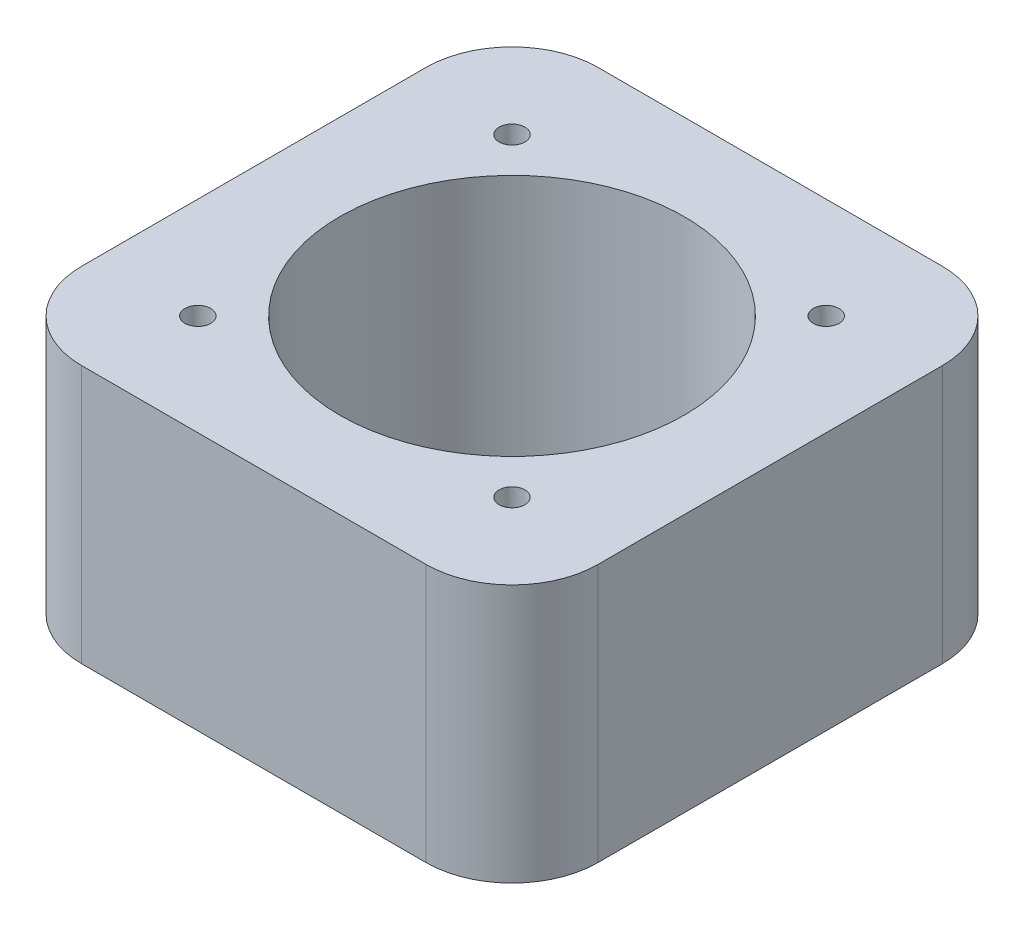
ISO-10303-21;
HEADER;
FILE_DESCRIPTION(('STEP AP214'),'2;1');
FILE_NAME('part.step','',(''),(''),'','','');
FILE_SCHEMA(('AUTOMOTIVE_DESIGN { 1 0 10303 214 1 1 1 1 }'));
ENDSEC;
DATA;
#1=APPLICATION_CONTEXT('core data for automotive mechanical design processes');
#2=APPLICATION_PROTOCOL_DEFINITION('international standard','automotive_design',2000,#1);
#3=PRODUCT_CONTEXT('',#1,'mechanical');
#4=PRODUCT('Part','Part','',(#3));
#5=PRODUCT_RELATED_PRODUCT_CATEGORY('part','',(#4));
#6=PRODUCT_DEFINITION_FORMATION('','',#4);
#7=PRODUCT_DEFINITION_CONTEXT('part definition',#1,'design');
#8=PRODUCT_DEFINITION('design','',#6,#7);
#9=PRODUCT_DEFINITION_SHAPE('','',#8);
#10=(LENGTH_UNIT() NAMED_UNIT(*) SI_UNIT(.MILLI.,.METRE.));
#11=(NAMED_UNIT(*) PLANE_ANGLE_UNIT() SI_UNIT($,.RADIAN.));
#12=(NAMED_UNIT(*) SI_UNIT($,.STERADIAN.) SOLID_ANGLE_UNIT());
#13=UNCERTAINTY_MEASURE_WITH_UNIT(LENGTH_MEASURE(1.E-05),#10,'distance_accuracy_value','');
#14=(GEOMETRIC_REPRESENTATION_CONTEXT(3) GLOBAL_UNCERTAINTY_ASSIGNED_CONTEXT((#13)) GLOBAL_UNIT_ASSIGNED_CONTEXT((#10,
#11,#12)) REPRESENTATION_CONTEXT('',''));
#15=CARTESIAN_POINT('',(0.,0.,0.));
#16=DIRECTION('',(0.,0.,1.));
#17=DIRECTION('',(1.,0.,0.));
#18=AXIS2_PLACEMENT_3D('',#15,#16,#17);
#19=CARTESIAN_POINT('',(0.,30.,0.));
#20=DIRECTION('',(1.,0.,0.));
#21=DIRECTION('',(0.,0.,-1.));
#22=AXIS2_PLACEMENT_3D('',#19,#20,#21);
#23=PLANE('',#22);
#24=DIRECTION('',(0.,-1.,0.));
#25=VECTOR('',#24,1.);
#26=CARTESIAN_POINT('',(0.,30.,-10.));
#27=LINE('',#26,#25);
#28=CARTESIAN_POINT('',(0.,0.,-10.));
#29=VERTEX_POINT('',#28);
#30=CARTESIAN_POINT('',(0.,12.8349364905389,-10.));
#31=VERTEX_POINT('',#30);
#32=EDGE_CURVE('E385',#29,#31,#27,.F.);
#33=ORIENTED_EDGE('',*,*,#32,.T.);
#34=CARTESIAN_POINT('',(0.,15.,-11.25));
#35=DIRECTION('',(-1.,0.,0.));
#36=DIRECTION('',(0.,0.,1.));
#37=AXIS2_PLACEMENT_3D('',#34,#35,#36);
#38=CIRCLE('',#37,2.5);
#39=CARTESIAN_POINT('',(0.,12.75,-10.1602752641148));
#40=VERTEX_POINT('',#39);
#41=EDGE_CURVE('E243',#40,#31,#38,.T.);
#42=ORIENTED_EDGE('',*,*,#41,.F.);
#43=DIRECTION('',(0.,0.156499009549578,0.98767811558726));
#44=VECTOR('',#43,1.);
#45=CARTESIAN_POINT('',(0.,14.0082080848067,-2.21962059930137));
#46=LINE('',#45,#44);
#47=CARTESIAN_POINT('',(0.,10.25,-25.937980797682));
#48=VERTEX_POINT('',#47);
#49=EDGE_CURVE('E238',#48,#40,#46,.T.);
#50=ORIENTED_EDGE('',*,*,#49,.F.);
#51=CARTESIAN_POINT('',(0.,15.,-30.));
#52=DIRECTION('',(-1.,0.,0.));
#53=DIRECTION('',(0.,0.,1.));
#54=AXIS2_PLACEMENT_3D('',#51,#52,#53);
#55=CIRCLE('',#54,6.25);
#56=CARTESIAN_POINT('',(0.,10.25,-34.062019202318));
#57=VERTEX_POINT('',#56);
#58=EDGE_CURVE('E234',#57,#48,#55,.T.);
#59=ORIENTED_EDGE('',*,*,#58,.F.);
#60=DIRECTION('',(0.,-0.156499009549577,0.98767811558726));
#61=VECTOR('',#60,1.);
#62=CARTESIAN_POINT('',(0.,4.73396927421475,0.750104199901436));
#63=LINE('',#62,#61);
#64=CARTESIAN_POINT('',(0.,12.75,-49.8397247358852));
#65=VERTEX_POINT('',#64);
#66=EDGE_CURVE('E230',#65,#57,#63,.T.);
#67=ORIENTED_EDGE('',*,*,#66,.F.);
#68=CARTESIAN_POINT('',(0.,15.,-48.75));
#69=DIRECTION('',(-1.,0.,0.));
#70=DIRECTION('',(0.,0.,1.));
#71=AXIS2_PLACEMENT_3D('',#68,#69,#70);
#72=CIRCLE('',#71,2.5);
#73=CARTESIAN_POINT('',(0.,12.8349364905389,-50.));
#74=VERTEX_POINT('',#73);
#75=EDGE_CURVE('E226',#74,#65,#72,.T.);
#76=ORIENTED_EDGE('',*,*,#75,.F.);
#77=DIRECTION('',(0.,-1.,0.));
#78=VECTOR('',#77,1.);
#79=CARTESIAN_POINT('',(0.,30.,-50.));
#80=LINE('',#79,#78);
#81=CARTESIAN_POINT('',(0.,0.,-50.));
#82=VERTEX_POINT('',#81);
#83=EDGE_CURVE('E379',#74,#82,#80,.T.);
#84=ORIENTED_EDGE('',*,*,#83,.T.);
#85=DIRECTION('',(0.,0.,1.));
#86=VECTOR('',#85,1.);
#87=CARTESIAN_POINT('',(0.,0.,0.));
#88=LINE('',#87,#86);
#89=EDGE_CURVE('E308',#82,#29,#88,.T.);
#90=ORIENTED_EDGE('',*,*,#89,.T.);
#91=EDGE_LOOP('',(#33,#42,#50,#59,#67,#76,#84,#90));
#92=FACE_BOUND('',#91,.T.);
#93=ADVANCED_FACE('F44',(#92),#23,.F.);
#94=CARTESIAN_POINT('',(0.,30.,0.));
#95=DIRECTION('',(0.,-1.,0.));
#96=DIRECTION('',(0.,0.,-1.));
#97=AXIS2_PLACEMENT_3D('',#94,#95,#96);
#98=PLANE('',#97);
#99=DIRECTION('',(1.,0.,0.));
#100=VECTOR('',#99,1.);
#101=CARTESIAN_POINT('',(0.,30.,0.));
#102=LINE('',#101,#100);
#103=CARTESIAN_POINT('',(10.,30.,0.));
#104=VERTEX_POINT('',#103);
#105=CARTESIAN_POINT('',(50.,30.,0.));
#106=VERTEX_POINT('',#105);
#107=EDGE_CURVE('E316',#104,#106,#102,.T.);
#108=ORIENTED_EDGE('',*,*,#107,.T.);
#109=CARTESIAN_POINT('',(50.,30.,-10.));
#110=DIRECTION('',(0.,-1.,0.));
#111=DIRECTION('',(0.,0.,-1.));
#112=AXIS2_PLACEMENT_3D('',#109,#110,#111);
#113=CIRCLE('',#112,10.);
#114=CARTESIAN_POINT('',(60.,30.,-10.));
#115=VERTEX_POINT('',#114);
#116=EDGE_CURVE('E376',#106,#115,#113,.F.);
#117=ORIENTED_EDGE('',*,*,#116,.T.);
#118=DIRECTION('',(0.,0.,-1.));
#119=VECTOR('',#118,1.);
#120=CARTESIAN_POINT('',(60.,30.,0.));
#121=LINE('',#120,#119);
#122=CARTESIAN_POINT('',(60.,30.,-50.));
#123=VERTEX_POINT('',#122);
#124=EDGE_CURVE('E321',#115,#123,#121,.T.);
#125=ORIENTED_EDGE('',*,*,#124,.T.);
#126=CARTESIAN_POINT('',(50.,30.,-50.));
#127=DIRECTION('',(0.,-1.,0.));
#128=DIRECTION('',(0.,0.,-1.));
#129=AXIS2_PLACEMENT_3D('',#126,#127,#128);
#130=CIRCLE('',#129,10.);
#131=CARTESIAN_POINT('',(50.,30.,-60.));
#132=VERTEX_POINT('',#131);
#133=EDGE_CURVE('E367',#123,#132,#130,.F.);
#134=ORIENTED_EDGE('',*,*,#133,.T.);
#135=DIRECTION('',(-1.,0.,0.));
#136=VECTOR('',#135,1.);
#137=CARTESIAN_POINT('',(0.,30.,-60.));
#138=LINE('',#137,#136);
#139=CARTESIAN_POINT('',(10.,30.,-60.));
#140=VERTEX_POINT('',#139);
#141=EDGE_CURVE('E325',#132,#140,#138,.T.);
#142=ORIENTED_EDGE('',*,*,#141,.T.);
#143=CARTESIAN_POINT('',(10.,30.,-50.));
#144=DIRECTION('',(0.,-1.,0.));
#145=DIRECTION('',(0.,0.,-1.));
#146=AXIS2_PLACEMENT_3D('',#143,#144,#145);
#147=CIRCLE('',#146,10.);
#148=CARTESIAN_POINT('',(0.,30.,-50.));
#149=VERTEX_POINT('',#148);
#150=EDGE_CURVE('E370',#140,#149,#147,.F.);
#151=ORIENTED_EDGE('',*,*,#150,.T.);
#152=DIRECTION('',(0.,0.,1.));
#153=VECTOR('',#152,1.);
#154=CARTESIAN_POINT('',(0.,30.,0.));
#155=LINE('',#154,#153);
#156=CARTESIAN_POINT('',(0.,30.,-10.));
#157=VERTEX_POINT('',#156);
#158=EDGE_CURVE('E312',#149,#157,#155,.T.);
#159=ORIENTED_EDGE('',*,*,#158,.T.);
#160=CARTESIAN_POINT('',(10.,30.,-10.));
#161=DIRECTION('',(0.,-1.,0.));
#162=DIRECTION('',(0.,0.,-1.));
#163=AXIS2_PLACEMENT_3D('',#160,#161,#162);
#164=CIRCLE('',#163,10.);
#165=EDGE_CURVE('E373',#157,#104,#164,.F.);
#166=ORIENTED_EDGE('',*,*,#165,.T.);
#167=EDGE_LOOP('',(#108,#117,#125,#134,#142,#151,#159,#166));
#168=FACE_BOUND('',#167,.T.);
#169=CARTESIAN_POINT('',(30.,30.,-30.));
#170=DIRECTION('',(0.,1.,0.));
#171=DIRECTION('',(0.,0.,1.));
#172=AXIS2_PLACEMENT_3D('',#169,#170,#171);
#173=CIRCLE('',#172,20.);
#174=CARTESIAN_POINT('',(30.,30.,-9.99999999999999));
#175=VERTEX_POINT('',#174);
#176=EDGE_CURVE('E304',#175,#175,#173,.T.);
#177=ORIENTED_EDGE('',*,*,#176,.F.);
#178=EDGE_LOOP('',(#177));
#179=FACE_BOUND('',#178,.T.);
#180=CARTESIAN_POINT('',(48.25,30.,-48.25));
#181=DIRECTION('',(0.,1.,0.));
#182=DIRECTION('',(0.,0.,1.));
#183=AXIS2_PLACEMENT_3D('',#180,#181,#182);
#184=CIRCLE('',#183,1.5);
#185=CARTESIAN_POINT('',(48.25,30.,-46.75));
#186=VERTEX_POINT('',#185);
#187=EDGE_CURVE('E296',#186,#186,#184,.T.);
#188=ORIENTED_EDGE('',*,*,#187,.F.);
#189=EDGE_LOOP('',(#188));
#190=FACE_BOUND('',#189,.T.);
#191=CARTESIAN_POINT('',(11.75,30.,-48.25));
#192=DIRECTION('',(0.,1.,0.));
#193=DIRECTION('',(0.,0.,1.));
#194=AXIS2_PLACEMENT_3D('',#191,#192,#193);
#195=CIRCLE('',#194,1.5);
#196=CARTESIAN_POINT('',(11.75,30.,-46.75));
#197=VERTEX_POINT('',#196);
#198=EDGE_CURVE('E288',#197,#197,#195,.T.);
#199=ORIENTED_EDGE('',*,*,#198,.F.);
#200=EDGE_LOOP('',(#199));
#201=FACE_BOUND('',#200,.T.);
#202=CARTESIAN_POINT('',(11.75,30.,-11.75));
#203=DIRECTION('',(0.,1.,0.));
#204=DIRECTION('',(0.,0.,1.));
#205=AXIS2_PLACEMENT_3D('',#202,#203,#204);
#206=CIRCLE('',#205,1.5);
#207=CARTESIAN_POINT('',(11.75,30.,-10.25));
#208=VERTEX_POINT('',#207);
#209=EDGE_CURVE('E280',#208,#208,#206,.T.);
#210=ORIENTED_EDGE('',*,*,#209,.F.);
#211=EDGE_LOOP('',(#210));
#212=FACE_BOUND('',#211,.T.);
#213=CARTESIAN_POINT('',(48.25,30.,-11.75));
#214=DIRECTION('',(0.,1.,0.));
#215=DIRECTION('',(0.,0.,1.));
#216=AXIS2_PLACEMENT_3D('',#213,#214,#215);
#217=CIRCLE('',#216,1.5);
#218=CARTESIAN_POINT('',(48.25,30.,-10.25));
#219=VERTEX_POINT('',#218);
#220=EDGE_CURVE('E272',#219,#219,#217,.T.);
#221=ORIENTED_EDGE('',*,*,#220,.F.);
#222=EDGE_LOOP('',(#221));
#223=FACE_BOUND('',#222,.T.);
#224=ADVANCED_FACE('F433',(#168,#179,#190,#201,#212,#223),#98,.F.);
#225=CARTESIAN_POINT('',(0.,0.,0.));
#226=DIRECTION('',(0.,-1.,0.));
#227=DIRECTION('',(0.,0.,-1.));
#228=AXIS2_PLACEMENT_3D('',#225,#226,#227);
#229=PLANE('',#228);
#230=CARTESIAN_POINT('',(11.75,0.,-11.75));
#231=DIRECTION('',(0.,1.,0.));
#232=DIRECTION('',(0.,0.,1.));
#233=AXIS2_PLACEMENT_3D('',#230,#231,#232);
#234=CIRCLE('',#233,1.5);
#235=CARTESIAN_POINT('',(11.75,0.,-10.25));
#236=VERTEX_POINT('',#235);
#237=EDGE_CURVE('E276',#236,#236,#234,.T.);
#238=ORIENTED_EDGE('',*,*,#237,.T.);
#239=EDGE_LOOP('',(#238));
#240=FACE_BOUND('',#239,.T.);
#241=CARTESIAN_POINT('',(48.25,0.,-48.25));
#242=DIRECTION('',(0.,1.,0.));
#243=DIRECTION('',(0.,0.,1.));
#244=AXIS2_PLACEMENT_3D('',#241,#242,#243);
#245=CIRCLE('',#244,1.5);
#246=CARTESIAN_POINT('',(48.25,0.,-46.75));
#247=VERTEX_POINT('',#246);
#248=EDGE_CURVE('E292',#247,#247,#245,.T.);
#249=ORIENTED_EDGE('',*,*,#248,.T.);
#250=EDGE_LOOP('',(#249));
#251=FACE_BOUND('',#250,.T.);
#252=DIRECTION('',(0.,0.,-1.));
#253=VECTOR('',#252,1.);
#254=CARTESIAN_POINT('',(60.,0.,0.));
#255=LINE('',#254,#253);
#256=CARTESIAN_POINT('',(60.,0.,-10.));
#257=VERTEX_POINT('',#256);
#258=CARTESIAN_POINT('',(60.,0.,-50.));
#259=VERTEX_POINT('',#258);
#260=EDGE_CURVE('E336',#257,#259,#255,.T.);
#261=ORIENTED_EDGE('',*,*,#260,.F.);
#262=CARTESIAN_POINT('',(50.,0.,-10.));
#263=DIRECTION('',(0.,-1.,0.));
#264=DIRECTION('',(0.,0.,-1.));
#265=AXIS2_PLACEMENT_3D('',#262,#263,#264);
#266=CIRCLE('',#265,10.);
#267=CARTESIAN_POINT('',(50.,0.,0.));
#268=VERTEX_POINT('',#267);
#269=EDGE_CURVE('E357',#257,#268,#266,.T.);
#270=ORIENTED_EDGE('',*,*,#269,.T.);
#271=DIRECTION('',(1.,0.,0.));
#272=VECTOR('',#271,1.);
#273=CARTESIAN_POINT('',(0.,0.,0.));
#274=LINE('',#273,#272);
#275=CARTESIAN_POINT('',(10.,0.,0.));
#276=VERTEX_POINT('',#275);
#277=EDGE_CURVE('E332',#276,#268,#274,.T.);
#278=ORIENTED_EDGE('',*,*,#277,.F.);
#279=CARTESIAN_POINT('',(10.,0.,-10.));
#280=DIRECTION('',(0.,-1.,0.));
#281=DIRECTION('',(0.,0.,-1.));
#282=AXIS2_PLACEMENT_3D('',#279,#280,#281);
#283=CIRCLE('',#282,10.);
#284=EDGE_CURVE('E354',#276,#29,#283,.T.);
#285=ORIENTED_EDGE('',*,*,#284,.T.);
#286=ORIENTED_EDGE('',*,*,#89,.F.);
#287=CARTESIAN_POINT('',(10.,0.,-50.));
#288=DIRECTION('',(0.,-1.,0.));
#289=DIRECTION('',(0.,0.,-1.));
#290=AXIS2_PLACEMENT_3D('',#287,#288,#289);
#291=CIRCLE('',#290,10.);
#292=CARTESIAN_POINT('',(10.,0.,-60.));
#293=VERTEX_POINT('',#292);
#294=EDGE_CURVE('E351',#82,#293,#291,.T.);
#295=ORIENTED_EDGE('',*,*,#294,.T.);
#296=DIRECTION('',(-1.,0.,0.));
#297=VECTOR('',#296,1.);
#298=CARTESIAN_POINT('',(0.,0.,-60.));
#299=LINE('',#298,#297);
#300=CARTESIAN_POINT('',(50.,0.,-60.));
#301=VERTEX_POINT('',#300);
#302=EDGE_CURVE('E317',#301,#293,#299,.T.);
#303=ORIENTED_EDGE('',*,*,#302,.F.);
#304=CARTESIAN_POINT('',(50.,0.,-50.));
#305=DIRECTION('',(0.,-1.,0.));
#306=DIRECTION('',(0.,0.,-1.));
#307=AXIS2_PLACEMENT_3D('',#304,#305,#306);
#308=CIRCLE('',#307,10.);
#309=EDGE_CURVE('E348',#301,#259,#308,.T.);
#310=ORIENTED_EDGE('',*,*,#309,.T.);
#311=EDGE_LOOP('',(#261,#270,#278,#285,#286,#295,#303,#310));
#312=FACE_BOUND('',#311,.T.);
#313=CARTESIAN_POINT('',(30.,0.,-30.));
#314=DIRECTION('',(0.,1.,0.));
#315=DIRECTION('',(0.,0.,1.));
#316=AXIS2_PLACEMENT_3D('',#313,#314,#315);
#317=CIRCLE('',#316,20.);
#318=CARTESIAN_POINT('',(30.,0.,-9.99999999999999));
#319=VERTEX_POINT('',#318);
#320=EDGE_CURVE('E300',#319,#319,#317,.T.);
#321=ORIENTED_EDGE('',*,*,#320,.T.);
#322=EDGE_LOOP('',(#321));
#323=FACE_BOUND('',#322,.T.);
#324=CARTESIAN_POINT('',(11.75,0.,-48.25));
#325=DIRECTION('',(0.,1.,0.));
#326=DIRECTION('',(0.,0.,1.));
#327=AXIS2_PLACEMENT_3D('',#324,#325,#326);
#328=CIRCLE('',#327,1.5);
#329=CARTESIAN_POINT('',(11.75,0.,-46.75));
#330=VERTEX_POINT('',#329);
#331=EDGE_CURVE('E284',#330,#330,#328,.T.);
#332=ORIENTED_EDGE('',*,*,#331,.T.);
#333=EDGE_LOOP('',(#332));
#334=FACE_BOUND('',#333,.T.);
#335=CARTESIAN_POINT('',(48.25,0.,-11.75));
#336=DIRECTION('',(0.,1.,0.));
#337=DIRECTION('',(0.,0.,1.));
#338=AXIS2_PLACEMENT_3D('',#335,#336,#337);
#339=CIRCLE('',#338,1.5);
#340=CARTESIAN_POINT('',(48.25,0.,-10.25));
#341=VERTEX_POINT('',#340);
#342=EDGE_CURVE('E253',#341,#341,#339,.T.);
#343=ORIENTED_EDGE('',*,*,#342,.T.);
#344=EDGE_LOOP('',(#343));
#345=FACE_BOUND('',#344,.T.);
#346=ADVANCED_FACE('F436',(#240,#251,#312,#323,#334,#345),#229,.T.);
#347=DIRECTION('',(0.,-0.156499009549577,0.98767811558726));
#348=VECTOR('',#347,1.);
#349=CARTESIAN_POINT('',(0.,15.2570337154933,2.41749880599461));
#350=LINE('',#349,#348);
#351=CARTESIAN_POINT('',(0.,19.75,-25.937980797682));
#352=VERTEX_POINT('',#351);
#353=CARTESIAN_POINT('',(0.,17.25,-10.1602752641148));
#354=VERTEX_POINT('',#353);
#355=EDGE_CURVE('E246',#352,#354,#350,.T.);
#356=ORIENTED_EDGE('',*,*,#355,.T.);
#357=CARTESIAN_POINT('',(0.,17.1650635094611,-10.));
#358=VERTEX_POINT('',#357);
#359=EDGE_CURVE('E242',#358,#354,#38,.T.);
#360=ORIENTED_EDGE('',*,*,#359,.F.);
#361=EDGE_CURVE('E384',#358,#157,#27,.F.);
#362=ORIENTED_EDGE('',*,*,#361,.T.);
#363=ORIENTED_EDGE('',*,*,#158,.F.);
#364=CARTESIAN_POINT('',(0.,17.1650635094611,-50.));
#365=VERTEX_POINT('',#364);
#366=EDGE_CURVE('E380',#149,#365,#80,.T.);
#367=ORIENTED_EDGE('',*,*,#366,.T.);
#368=CARTESIAN_POINT('',(0.,17.25,-49.8397247358852));
#369=VERTEX_POINT('',#368);
#370=EDGE_CURVE('E66',#369,#365,#72,.T.);
#371=ORIENTED_EDGE('',*,*,#370,.F.);
#372=DIRECTION('',(0.,0.156499009549577,0.98767811558726));
#373=VECTOR('',#372,1.);
#374=CARTESIAN_POINT('',(0.,24.5312725260853,-3.88701520539454));
#375=LINE('',#374,#373);
#376=CARTESIAN_POINT('',(0.,19.75,-34.062019202318));
#377=VERTEX_POINT('',#376);
#378=EDGE_CURVE('E182',#369,#377,#375,.T.);
#379=ORIENTED_EDGE('',*,*,#378,.T.);
#380=EDGE_CURVE('E197',#352,#377,#55,.T.);
#381=ORIENTED_EDGE('',*,*,#380,.F.);
#382=EDGE_LOOP('',(#356,#360,#362,#363,#367,#371,#379,#381));
#383=FACE_BOUND('',#382,.T.);
#384=ADVANCED_FACE('F440',(#383),#23,.F.);
#385=CARTESIAN_POINT('',(0.,30.,0.));
#386=DIRECTION('',(0.,0.,-1.));
#387=DIRECTION('',(-1.,0.,0.));
#388=AXIS2_PLACEMENT_3D('',#385,#386,#387);
#389=PLANE('',#388);
#390=ORIENTED_EDGE('',*,*,#277,.T.);
#391=DIRECTION('',(0.,-1.,0.));
#392=VECTOR('',#391,1.);
#393=CARTESIAN_POINT('',(50.,30.,0.));
#394=LINE('',#393,#392);
#395=EDGE_CURVE('E364',#268,#106,#394,.F.);
#396=ORIENTED_EDGE('',*,*,#395,.T.);
#397=ORIENTED_EDGE('',*,*,#107,.F.);
#398=DIRECTION('',(0.,-1.,0.));
#399=VECTOR('',#398,1.);
#400=CARTESIAN_POINT('',(10.,30.,0.));
#401=LINE('',#400,#399);
#402=EDGE_CURVE('E360',#104,#276,#401,.T.);
#403=ORIENTED_EDGE('',*,*,#402,.T.);
#404=EDGE_LOOP('',(#390,#396,#397,#403));
#405=FACE_BOUND('',#404,.T.);
#406=ADVANCED_FACE('F447',(#405),#389,.F.);
#407=CARTESIAN_POINT('',(60.,30.,0.));
#408=DIRECTION('',(-1.,0.,0.));
#409=DIRECTION('',(0.,0.,1.));
#410=AXIS2_PLACEMENT_3D('',#407,#408,#409);
#411=PLANE('',#410);
#412=ORIENTED_EDGE('',*,*,#124,.F.);
#413=DIRECTION('',(0.,-1.,0.));
#414=VECTOR('',#413,1.);
#415=CARTESIAN_POINT('',(60.,30.,-10.));
#416=LINE('',#415,#414);
#417=EDGE_CURVE('E344',#115,#257,#416,.T.);
#418=ORIENTED_EDGE('',*,*,#417,.T.);
#419=ORIENTED_EDGE('',*,*,#260,.T.);
#420=DIRECTION('',(0.,-1.,0.));
#421=VECTOR('',#420,1.);
#422=CARTESIAN_POINT('',(60.,30.,-50.));
#423=LINE('',#422,#421);
#424=EDGE_CURVE('E328',#259,#123,#423,.F.);
#425=ORIENTED_EDGE('',*,*,#424,.T.);
#426=EDGE_LOOP('',(#412,#418,#419,#425));
#427=FACE_BOUND('',#426,.T.);
#428=ADVANCED_FACE('F444',(#427),#411,.F.);
#429=CARTESIAN_POINT('',(0.,30.,-60.));
#430=DIRECTION('',(0.,0.,1.));
#431=DIRECTION('',(1.,0.,0.));
#432=AXIS2_PLACEMENT_3D('',#429,#430,#431);
#433=PLANE('',#432);
#434=ORIENTED_EDGE('',*,*,#302,.T.);
#435=DIRECTION('',(0.,-1.,0.));
#436=VECTOR('',#435,1.);
#437=CARTESIAN_POINT('',(10.,30.,-60.));
#438=LINE('',#437,#436);
#439=EDGE_CURVE('E74',#293,#140,#438,.F.);
#440=ORIENTED_EDGE('',*,*,#439,.T.);
#441=ORIENTED_EDGE('',*,*,#141,.F.);
#442=DIRECTION('',(0.,-1.,0.));
#443=VECTOR('',#442,1.);
#444=CARTESIAN_POINT('',(50.,30.,-60.));
#445=LINE('',#444,#443);
#446=EDGE_CURVE('E389',#132,#301,#445,.T.);
#447=ORIENTED_EDGE('',*,*,#446,.T.);
#448=EDGE_LOOP('',(#434,#440,#441,#447));
#449=FACE_BOUND('',#448,.T.);
#450=ADVANCED_FACE('F431',(#449),#433,.F.);
#451=CARTESIAN_POINT('',(30.,30.,-30.));
#452=DIRECTION('',(0.,-1.,0.));
#453=DIRECTION('',(0.,0.,-1.));
#454=AXIS2_PLACEMENT_3D('',#451,#452,#453);
#455=CYLINDRICAL_SURFACE('',#454,20.);
#456=ORIENTED_EDGE('',*,*,#176,.T.);
#457=EDGE_LOOP('',(#456));
#458=FACE_BOUND('',#457,.T.);
#459=ORIENTED_EDGE('',*,*,#320,.F.);
#460=EDGE_LOOP('',(#459));
#461=FACE_BOUND('',#460,.T.);
#462=ADVANCED_FACE('F427',(#458,#461),#455,.F.);
#463=CARTESIAN_POINT('',(48.25,30.,-48.25));
#464=DIRECTION('',(0.,-1.,0.));
#465=DIRECTION('',(0.,0.,-1.));
#466=AXIS2_PLACEMENT_3D('',#463,#464,#465);
#467=CYLINDRICAL_SURFACE('',#466,1.5);
#468=ORIENTED_EDGE('',*,*,#187,.T.);
#469=EDGE_LOOP('',(#468));
#470=FACE_BOUND('',#469,.T.);
#471=ORIENTED_EDGE('',*,*,#248,.F.);
#472=EDGE_LOOP('',(#471));
#473=FACE_BOUND('',#472,.T.);
#474=ADVANCED_FACE('F423',(#470,#473),#467,.F.);
#475=CARTESIAN_POINT('',(11.75,30.,-48.25));
#476=DIRECTION('',(0.,-1.,0.));
#477=DIRECTION('',(0.,0.,-1.));
#478=AXIS2_PLACEMENT_3D('',#475,#476,#477);
#479=CYLINDRICAL_SURFACE('',#478,1.5);
#480=ORIENTED_EDGE('',*,*,#198,.T.);
#481=EDGE_LOOP('',(#480));
#482=FACE_BOUND('',#481,.T.);
#483=ORIENTED_EDGE('',*,*,#331,.F.);
#484=EDGE_LOOP('',(#483));
#485=FACE_BOUND('',#484,.T.);
#486=ADVANCED_FACE('F419',(#482,#485),#479,.F.);
#487=CARTESIAN_POINT('',(11.75,30.,-11.75));
#488=DIRECTION('',(0.,-1.,0.));
#489=DIRECTION('',(0.,0.,-1.));
#490=AXIS2_PLACEMENT_3D('',#487,#488,#489);
#491=CYLINDRICAL_SURFACE('',#490,1.5);
#492=ORIENTED_EDGE('',*,*,#209,.T.);
#493=EDGE_LOOP('',(#492));
#494=FACE_BOUND('',#493,.T.);
#495=ORIENTED_EDGE('',*,*,#237,.F.);
#496=EDGE_LOOP('',(#495));
#497=FACE_BOUND('',#496,.T.);
#498=ADVANCED_FACE('F415',(#494,#497),#491,.F.);
#499=CARTESIAN_POINT('',(48.25,30.,-11.75));
#500=DIRECTION('',(0.,-1.,0.));
#501=DIRECTION('',(0.,0.,-1.));
#502=AXIS2_PLACEMENT_3D('',#499,#500,#501);
#503=CYLINDRICAL_SURFACE('',#502,1.5);
#504=ORIENTED_EDGE('',*,*,#220,.T.);
#505=EDGE_LOOP('',(#504));
#506=FACE_BOUND('',#505,.T.);
#507=ORIENTED_EDGE('',*,*,#342,.F.);
#508=EDGE_LOOP('',(#507));
#509=FACE_BOUND('',#508,.T.);
#510=ADVANCED_FACE('F411',(#506,#509),#503,.F.);
#511=CARTESIAN_POINT('',(50.,30.,-10.));
#512=DIRECTION('',(0.,-1.,0.));
#513=DIRECTION('',(0.,0.,-1.));
#514=AXIS2_PLACEMENT_3D('',#511,#512,#513);
#515=CYLINDRICAL_SURFACE('',#514,10.);
#516=ORIENTED_EDGE('',*,*,#116,.F.);
#517=ORIENTED_EDGE('',*,*,#395,.F.);
#518=ORIENTED_EDGE('',*,*,#269,.F.);
#519=ORIENTED_EDGE('',*,*,#417,.F.);
#520=EDGE_LOOP('',(#516,#517,#518,#519));
#521=FACE_BOUND('',#520,.T.);
#522=ADVANCED_FACE('F414',(#521),#515,.T.);
#523=CARTESIAN_POINT('',(10.,30.,-10.));
#524=DIRECTION('',(0.,-1.,0.));
#525=DIRECTION('',(0.,0.,-1.));
#526=AXIS2_PLACEMENT_3D('',#523,#524,#525);
#527=CYLINDRICAL_SURFACE('',#526,10.);
#528=CARTESIAN_POINT('',(0.,12.8349364905389,-10.));
#529=CARTESIAN_POINT('',(-3.05433351613283E-06,12.8699765742521,-9.93929449291478));
#530=CARTESIAN_POINT('',(0.000552766217667145,12.9075787501651,-9.88007532989068));
#531=CARTESIAN_POINT('',(0.00259643317986223,12.9876053754906,-9.76501895531367));
#532=CARTESIAN_POINT('',(0.00408414841257835,13.0300291455029,-9.70918126897969));
#533=CARTESIAN_POINT('',(0.00780418634332466,13.1193638971462,-9.60133192840021));
#534=CARTESIAN_POINT('',(0.0100357881794121,13.166270503425,-9.5493166294034));
#535=CARTESIAN_POINT('',(0.0150429052809726,13.2642493991256,-9.44942476345379));
#536=CARTESIAN_POINT('',(0.0178184277700505,13.3153217438658,-9.40154825147884));
#537=CARTESIAN_POINT('',(0.0266560427942999,13.4742844124832,-9.26462673172967));
#538=CARTESIAN_POINT('',(0.0332326888007357,13.5879905574424,-9.18220518527838));
#539=CARTESIAN_POINT('',(0.0461554299428423,13.8275127942844,-9.0375638547914));
#540=CARTESIAN_POINT('',(0.0525015446195688,13.9533278564363,-8.9753423549275));
#541=CARTESIAN_POINT('',(0.0636331107181417,14.2144119142727,-8.87247289832288));
#542=CARTESIAN_POINT('',(0.068409477227433,14.349730625882,-8.83194969965524));
#543=CARTESIAN_POINT('',(0.0753669741801075,14.6253299332914,-8.77422775113699));
#544=CARTESIAN_POINT('',(0.0775479259818304,14.7656108699559,-8.75703060680073));
#545=CARTESIAN_POINT('',(0.0788711293391911,15.0461796871119,-8.74651284629797));
#546=CARTESIAN_POINT('',(0.0780327218997642,15.1864617876353,-8.75304026102862));
#547=CARTESIAN_POINT('',(0.073526991595015,15.4638980553361,-8.78943696294128));
#548=CARTESIAN_POINT('',(0.0698600070553227,15.6010525945808,-8.81930345854533));
#549=CARTESIAN_POINT('',(0.0604431798062219,15.868102645469,-8.90140967574756));
#550=CARTESIAN_POINT('',(0.0546975762616776,15.9980123144836,-8.95360390110519));
#551=CARTESIAN_POINT('',(0.0423117205274593,16.2473517819678,-9.07892029320663));
#552=CARTESIAN_POINT('',(0.0356710148053121,16.366776216766,-9.15205309040978));
#553=CARTESIAN_POINT('',(0.0229427991449662,16.5927050202293,-9.31787589359762));
#554=CARTESIAN_POINT('',(0.0168603029163541,16.6990947180734,-9.41072220973634));
#555=CARTESIAN_POINT('',(0.00698427579444546,16.8946706118564,-9.61295056321118));
#556=CARTESIAN_POINT('',(0.00318621958241282,16.9838905796991,-9.72229936884287));
#557=CARTESIAN_POINT('',(0.000882715033580595,17.0812201908419,-9.86452269156955));
#558=CARTESIAN_POINT('',(0.000555445608364421,17.0987248372568,-9.89118617750323));
#559=CARTESIAN_POINT('',(0.000114379919135497,17.132679824218,-9.94512941874416));
#560=CARTESIAN_POINT('',(3.05864034593677E-07,17.1491315097125,-9.97240832516622));
#561=CARTESIAN_POINT('',(0.,17.1650635094611,-10.));
#562=B_SPLINE_CURVE_WITH_KNOTS('',3,(#528,#529,#530,#531,#532,#533,#534,#535,#536,#537,#538,
#539,#540,#541,#542,#543,#544,#545,#546,#547,#548,#549,#550,#551,#552,#553,#554,#555,#556,#557,
#558,#559,#560,#561),.UNSPECIFIED.,.F.,.F.,(4,2,2,2,2,2,2,2,2,2,2,2,2,2,2,2,4),(0.,
0.210203105112318,0.420376627600125,0.630347071049254,0.840320303225613,1.25994106275458,
1.67952616961168,2.1014985297368,2.52349993242059,2.94280295722885,3.36205583704836,
3.78045846263801,4.19907388799613,4.62114153975234,5.04237032702962,5.13805036098576,
5.23360563781669),.UNSPECIFIED.);
#563=EDGE_CURVE('E11',#31,#358,#562,.T.);
#564=ORIENTED_EDGE('',*,*,#563,.F.);
#565=ORIENTED_EDGE('',*,*,#32,.F.);
#566=ORIENTED_EDGE('',*,*,#284,.F.);
#567=ORIENTED_EDGE('',*,*,#402,.F.);
#568=ORIENTED_EDGE('',*,*,#165,.F.);
#569=ORIENTED_EDGE('',*,*,#361,.F.);
#570=EDGE_LOOP('',(#564,#565,#566,#567,#568,#569));
#571=FACE_BOUND('',#570,.T.);
#572=ADVANCED_FACE('F456',(#571),#527,.T.);
#573=CARTESIAN_POINT('',(10.,30.,-50.));
#574=DIRECTION('',(0.,-1.,0.));
#575=DIRECTION('',(0.,0.,-1.));
#576=AXIS2_PLACEMENT_3D('',#573,#574,#575);
#577=CYLINDRICAL_SURFACE('',#576,10.);
#578=CARTESIAN_POINT('',(0.,17.1650635094611,-50.));
#579=CARTESIAN_POINT('',(-3.05433351642164E-06,17.1300234257479,-50.0607055070852));
#580=CARTESIAN_POINT('',(0.000552766217667168,17.0924212498349,-50.1199246701093));
#581=CARTESIAN_POINT('',(0.00259643317986295,17.0123946245094,-50.2349810446863));
#582=CARTESIAN_POINT('',(0.00408414841257946,16.9699708544971,-50.2908187310203));
#583=CARTESIAN_POINT('',(0.00780418634332548,16.8806361028538,-50.3986680715998));
#584=CARTESIAN_POINT('',(0.0100357881794123,16.833729496575,-50.4506833705966));
#585=CARTESIAN_POINT('',(0.0150429052809729,16.7357506008744,-50.5505752365462));
#586=CARTESIAN_POINT('',(0.0178184277700517,16.6846782561342,-50.5984517485212));
#587=CARTESIAN_POINT('',(0.026656042794302,16.5257155875168,-50.7353732682703));
#588=CARTESIAN_POINT('',(0.0332326888007362,16.4120094425576,-50.8177948147216));
#589=CARTESIAN_POINT('',(0.0461554299428429,16.1724872057156,-50.9624361452086));
#590=CARTESIAN_POINT('',(0.052501544619571,16.0466721435637,-51.0246576450725));
#591=CARTESIAN_POINT('',(0.0636331107181439,15.7855880857273,-51.1275271016771));
#592=CARTESIAN_POINT('',(0.0684094772274334,15.650269374118,-51.1680503003448));
#593=CARTESIAN_POINT('',(0.0753669741801077,15.3746700667086,-51.225772248863));
#594=CARTESIAN_POINT('',(0.0775479259818319,15.2343891300441,-51.2429693931993));
#595=CARTESIAN_POINT('',(0.0788711293391927,14.9538203128881,-51.253487153702));
#596=CARTESIAN_POINT('',(0.0780327218997646,14.8135382123647,-51.2469597389714));
#597=CARTESIAN_POINT('',(0.0735269915950152,14.5361019446639,-51.2105630370587));
#598=CARTESIAN_POINT('',(0.069860007055324,14.3989474054192,-51.1806965414547));
#599=CARTESIAN_POINT('',(0.0604431798062227,14.131897354531,-51.0985903242524));
#600=CARTESIAN_POINT('',(0.0546975762616771,14.0019876855163,-51.0463960988948));
#601=CARTESIAN_POINT('',(0.0423117205274582,13.7526482180322,-50.9210797067934));
#602=CARTESIAN_POINT('',(0.0356710148053119,13.633223783234,-50.8479469095902));
#603=CARTESIAN_POINT('',(0.022942799144965,13.4072949797707,-50.6821241064024));
#604=CARTESIAN_POINT('',(0.016860302916351,13.3009052819266,-50.5892777902637));
#605=CARTESIAN_POINT('',(0.00698427579444371,13.1053293881436,-50.3870494367888));
#606=CARTESIAN_POINT('',(0.00318621958241416,13.0161094203009,-50.2777006311571));
#607=CARTESIAN_POINT('',(0.000882715033581803,12.918779809158,-50.1354773084304));
#608=CARTESIAN_POINT('',(0.000555445608365438,12.9012751627432,-50.1088138224968));
#609=CARTESIAN_POINT('',(0.000114379919136,12.867320175782,-50.0548705812558));
#610=CARTESIAN_POINT('',(3.05864034749013E-07,12.8508684902875,-50.0275916748338));
#611=CARTESIAN_POINT('',(0.,12.8349364905389,-50.));
#612=B_SPLINE_CURVE_WITH_KNOTS('',3,(#578,#579,#580,#581,#582,#583,#584,#585,#586,#587,#588,
#589,#590,#591,#592,#593,#594,#595,#596,#597,#598,#599,#600,#601,#602,#603,#604,#605,#606,#607,
#608,#609,#610,#611),.UNSPECIFIED.,.F.,.F.,(4,2,2,2,2,2,2,2,2,2,2,2,2,2,2,2,4),(0.,
0.210203105112319,0.420376627600126,0.630347071049252,0.84032030322562,1.25994106275458,
1.6795261696117,2.10149852973681,2.52349993242061,2.94280295722887,3.36205583704837,
3.78045846263802,4.19907388799615,4.62114153975237,5.04237032702964,5.13805036098578,
5.2336056378167),.UNSPECIFIED.);
#613=EDGE_CURVE('E59',#365,#74,#612,.T.);
#614=ORIENTED_EDGE('',*,*,#613,.F.);
#615=ORIENTED_EDGE('',*,*,#366,.F.);
#616=ORIENTED_EDGE('',*,*,#150,.F.);
#617=ORIENTED_EDGE('',*,*,#439,.F.);
#618=ORIENTED_EDGE('',*,*,#294,.F.);
#619=ORIENTED_EDGE('',*,*,#83,.F.);
#620=EDGE_LOOP('',(#614,#615,#616,#617,#618,#619));
#621=FACE_BOUND('',#620,.T.);
#622=ADVANCED_FACE('F400',(#621),#577,.T.);
#623=CARTESIAN_POINT('',(50.,30.,-50.));
#624=DIRECTION('',(0.,-1.,0.));
#625=DIRECTION('',(0.,0.,-1.));
#626=AXIS2_PLACEMENT_3D('',#623,#624,#625);
#627=CYLINDRICAL_SURFACE('',#626,10.);
#628=ORIENTED_EDGE('',*,*,#133,.F.);
#629=ORIENTED_EDGE('',*,*,#424,.F.);
#630=ORIENTED_EDGE('',*,*,#309,.F.);
#631=ORIENTED_EDGE('',*,*,#446,.F.);
#632=EDGE_LOOP('',(#628,#629,#630,#631));
#633=FACE_BOUND('',#632,.T.);
#634=ADVANCED_FACE('F46',(#633),#627,.T.);
#635=CARTESIAN_POINT('',(5.,24.5312725260853,-3.88701520539454));
#636=DIRECTION('',(0.,-0.98767811558726,0.156499009549577));
#637=DIRECTION('',(0.,-0.156499009549577,-0.98767811558726));
#638=AXIS2_PLACEMENT_3D('',#635,#636,#637);
#639=PLANE('',#638);
#640=ORIENTED_EDGE('',*,*,#378,.F.);
#641=DIRECTION('',(-1.,0.,0.));
#642=VECTOR('',#641,1.);
#643=CARTESIAN_POINT('',(5.,17.25,-49.8397247358852));
#644=LINE('',#643,#642);
#645=CARTESIAN_POINT('',(5.,17.25,-49.8397247358852));
#646=VERTEX_POINT('',#645);
#647=EDGE_CURVE('E176',#646,#369,#644,.T.);
#648=ORIENTED_EDGE('',*,*,#647,.F.);
#649=DIRECTION('',(0.,0.156499009549577,0.98767811558726));
#650=VECTOR('',#649,1.);
#651=CARTESIAN_POINT('',(5.,24.5312725260853,-3.88701520539454));
#652=LINE('',#651,#650);
#653=CARTESIAN_POINT('',(5.,19.75,-34.062019202318));
#654=VERTEX_POINT('',#653);
#655=EDGE_CURVE('E179',#646,#654,#652,.T.);
#656=ORIENTED_EDGE('',*,*,#655,.T.);
#657=DIRECTION('',(-1.,0.,0.));
#658=VECTOR('',#657,1.);
#659=CARTESIAN_POINT('',(5.,19.75,-34.062019202318));
#660=LINE('',#659,#658);
#661=EDGE_CURVE('E250',#654,#377,#660,.T.);
#662=ORIENTED_EDGE('',*,*,#661,.T.);
#663=EDGE_LOOP('',(#640,#648,#656,#662));
#664=FACE_BOUND('',#663,.T.);
#665=ADVANCED_FACE('F178',(#664),#639,.T.);
#666=CARTESIAN_POINT('',(5.,15.,-30.));
#667=DIRECTION('',(-1.,0.,0.));
#668=DIRECTION('',(0.,0.,1.));
#669=AXIS2_PLACEMENT_3D('',#666,#667,#668);
#670=CYLINDRICAL_SURFACE('',#669,6.25);
#671=ORIENTED_EDGE('',*,*,#380,.T.);
#672=ORIENTED_EDGE('',*,*,#661,.F.);
#673=CARTESIAN_POINT('',(5.,15.,-30.));
#674=DIRECTION('',(-1.,0.,0.));
#675=DIRECTION('',(0.,0.,1.));
#676=AXIS2_PLACEMENT_3D('',#673,#674,#675);
#677=CIRCLE('',#676,6.25);
#678=CARTESIAN_POINT('',(5.,19.75,-25.937980797682));
#679=VERTEX_POINT('',#678);
#680=EDGE_CURVE('E186',#679,#654,#677,.T.);
#681=ORIENTED_EDGE('',*,*,#680,.F.);
#682=DIRECTION('',(-1.,0.,0.));
#683=VECTOR('',#682,1.);
#684=CARTESIAN_POINT('',(5.,19.75,-25.937980797682));
#685=LINE('',#684,#683);
#686=EDGE_CURVE('E254',#679,#352,#685,.T.);
#687=ORIENTED_EDGE('',*,*,#686,.T.);
#688=EDGE_LOOP('',(#671,#672,#681,#687));
#689=FACE_BOUND('',#688,.T.);
#690=ADVANCED_FACE('F410',(#689),#670,.F.);
#691=CARTESIAN_POINT('',(5.,15.2570337154933,2.41749880599461));
#692=DIRECTION('',(0.,-0.98767811558726,-0.156499009549577));
#693=DIRECTION('',(0.,0.156499009549577,-0.98767811558726));
#694=AXIS2_PLACEMENT_3D('',#691,#692,#693);
#695=PLANE('',#694);
#696=ORIENTED_EDGE('',*,*,#355,.F.);
#697=ORIENTED_EDGE('',*,*,#686,.F.);
#698=DIRECTION('',(0.,-0.156499009549577,0.98767811558726));
#699=VECTOR('',#698,1.);
#700=CARTESIAN_POINT('',(5.,15.2570337154933,2.41749880599461));
#701=LINE('',#700,#699);
#702=CARTESIAN_POINT('',(5.,17.25,-10.1602752641148));
#703=VERTEX_POINT('',#702);
#704=EDGE_CURVE('E221',#679,#703,#701,.T.);
#705=ORIENTED_EDGE('',*,*,#704,.T.);
#706=DIRECTION('',(-1.,0.,0.));
#707=VECTOR('',#706,1.);
#708=CARTESIAN_POINT('',(5.,17.25,-10.1602752641148));
#709=LINE('',#708,#707);
#710=EDGE_CURVE('E257',#703,#354,#709,.T.);
#711=ORIENTED_EDGE('',*,*,#710,.T.);
#712=EDGE_LOOP('',(#696,#697,#705,#711));
#713=FACE_BOUND('',#712,.T.);
#714=ADVANCED_FACE('F540',(#713),#695,.T.);
#715=CARTESIAN_POINT('',(5.,15.,-11.25));
#716=DIRECTION('',(-1.,0.,0.));
#717=DIRECTION('',(0.,0.,1.));
#718=AXIS2_PLACEMENT_3D('',#715,#716,#717);
#719=CYLINDRICAL_SURFACE('',#718,2.5);
#720=ORIENTED_EDGE('',*,*,#563,.T.);
#721=ORIENTED_EDGE('',*,*,#359,.T.);
#722=ORIENTED_EDGE('',*,*,#710,.F.);
#723=CARTESIAN_POINT('',(5.,15.,-11.25));
#724=DIRECTION('',(-1.,0.,0.));
#725=DIRECTION('',(0.,0.,1.));
#726=AXIS2_PLACEMENT_3D('',#723,#724,#725);
#727=CIRCLE('',#726,2.5);
#728=CARTESIAN_POINT('',(5.,12.75,-10.1602752641148));
#729=VERTEX_POINT('',#728);
#730=EDGE_CURVE('E217',#729,#703,#727,.T.);
#731=ORIENTED_EDGE('',*,*,#730,.F.);
#732=DIRECTION('',(-1.,0.,0.));
#733=VECTOR('',#732,1.);
#734=CARTESIAN_POINT('',(5.,12.75,-10.1602752641148));
#735=LINE('',#734,#733);
#736=EDGE_CURVE('E261',#729,#40,#735,.T.);
#737=ORIENTED_EDGE('',*,*,#736,.T.);
#738=ORIENTED_EDGE('',*,*,#41,.T.);
#739=EDGE_LOOP('',(#720,#721,#722,#731,#737,#738));
#740=FACE_BOUND('',#739,.T.);
#741=ADVANCED_FACE('F480',(#740),#719,.F.);
#742=CARTESIAN_POINT('',(5.,14.0082080848067,-2.21962059930137));
#743=DIRECTION('',(0.,-0.98767811558726,0.156499009549578));
#744=DIRECTION('',(0.,-0.156499009549578,-0.98767811558726));
#745=AXIS2_PLACEMENT_3D('',#742,#743,#744);
#746=PLANE('',#745);
#747=ORIENTED_EDGE('',*,*,#49,.T.);
#748=ORIENTED_EDGE('',*,*,#736,.F.);
#749=DIRECTION('',(0.,0.156499009549578,0.98767811558726));
#750=VECTOR('',#749,1.);
#751=CARTESIAN_POINT('',(5.,14.0082080848067,-2.21962059930137));
#752=LINE('',#751,#750);
#753=CARTESIAN_POINT('',(5.,10.25,-25.937980797682));
#754=VERTEX_POINT('',#753);
#755=EDGE_CURVE('E213',#754,#729,#752,.T.);
#756=ORIENTED_EDGE('',*,*,#755,.F.);
#757=DIRECTION('',(-1.,0.,0.));
#758=VECTOR('',#757,1.);
#759=CARTESIAN_POINT('',(5.,10.25,-25.937980797682));
#760=LINE('',#759,#758);
#761=EDGE_CURVE('E264',#754,#48,#760,.T.);
#762=ORIENTED_EDGE('',*,*,#761,.T.);
#763=EDGE_LOOP('',(#747,#748,#756,#762));
#764=FACE_BOUND('',#763,.T.);
#765=ADVANCED_FACE('F547',(#764),#746,.F.);
#766=ORIENTED_EDGE('',*,*,#58,.T.);
#767=ORIENTED_EDGE('',*,*,#761,.F.);
#768=CARTESIAN_POINT('',(5.,10.25,-34.062019202318));
#769=VERTEX_POINT('',#768);
#770=EDGE_CURVE('E206',#769,#754,#677,.T.);
#771=ORIENTED_EDGE('',*,*,#770,.F.);
#772=DIRECTION('',(-1.,0.,0.));
#773=VECTOR('',#772,1.);
#774=CARTESIAN_POINT('',(5.,10.25,-34.062019202318));
#775=LINE('',#774,#773);
#776=EDGE_CURVE('E267',#769,#57,#775,.T.);
#777=ORIENTED_EDGE('',*,*,#776,.T.);
#778=EDGE_LOOP('',(#766,#767,#771,#777));
#779=FACE_BOUND('',#778,.T.);
#780=ADVANCED_FACE('F542',(#779),#670,.F.);
#781=CARTESIAN_POINT('',(5.,4.73396927421475,0.750104199901436));
#782=DIRECTION('',(0.,-0.98767811558726,-0.156499009549577));
#783=DIRECTION('',(0.,0.156499009549577,-0.98767811558726));
#784=AXIS2_PLACEMENT_3D('',#781,#782,#783);
#785=PLANE('',#784);
#786=ORIENTED_EDGE('',*,*,#66,.T.);
#787=ORIENTED_EDGE('',*,*,#776,.F.);
#788=DIRECTION('',(0.,-0.156499009549577,0.98767811558726));
#789=VECTOR('',#788,1.);
#790=CARTESIAN_POINT('',(5.,4.73396927421475,0.750104199901436));
#791=LINE('',#790,#789);
#792=CARTESIAN_POINT('',(5.,12.75,-49.8397247358852));
#793=VERTEX_POINT('',#792);
#794=EDGE_CURVE('E203',#793,#769,#791,.T.);
#795=ORIENTED_EDGE('',*,*,#794,.F.);
#796=DIRECTION('',(-1.,0.,0.));
#797=VECTOR('',#796,1.);
#798=CARTESIAN_POINT('',(5.,12.75,-49.8397247358852));
#799=LINE('',#798,#797);
#800=EDGE_CURVE('E185',#793,#65,#799,.T.);
#801=ORIENTED_EDGE('',*,*,#800,.T.);
#802=EDGE_LOOP('',(#786,#787,#795,#801));
#803=FACE_BOUND('',#802,.T.);
#804=ADVANCED_FACE('F406',(#803),#785,.F.);
#805=CARTESIAN_POINT('',(5.,15.,-48.75));
#806=DIRECTION('',(-1.,0.,0.));
#807=DIRECTION('',(0.,0.,1.));
#808=AXIS2_PLACEMENT_3D('',#805,#806,#807);
#809=CYLINDRICAL_SURFACE('',#808,2.5);
#810=ORIENTED_EDGE('',*,*,#613,.T.);
#811=ORIENTED_EDGE('',*,*,#75,.T.);
#812=ORIENTED_EDGE('',*,*,#800,.F.);
#813=CARTESIAN_POINT('',(5.,15.,-48.75));
#814=DIRECTION('',(-1.,0.,0.));
#815=DIRECTION('',(0.,0.,1.));
#816=AXIS2_PLACEMENT_3D('',#813,#814,#815);
#817=CIRCLE('',#816,2.5);
#818=EDGE_CURVE('E193',#646,#793,#817,.T.);
#819=ORIENTED_EDGE('',*,*,#818,.F.);
#820=ORIENTED_EDGE('',*,*,#647,.T.);
#821=ORIENTED_EDGE('',*,*,#370,.T.);
#822=EDGE_LOOP('',(#810,#811,#812,#819,#820,#821));
#823=FACE_BOUND('',#822,.T.);
#824=ADVANCED_FACE('F199',(#823),#809,.F.);
#825=CARTESIAN_POINT('',(5.,0.,0.));
#826=DIRECTION('',(-1.,0.,0.));
#827=DIRECTION('',(0.,0.,1.));
#828=AXIS2_PLACEMENT_3D('',#825,#826,#827);
#829=PLANE('',#828);
#830=CARTESIAN_POINT('',(5.,15.,-48.));
#831=DIRECTION('',(-1.,0.,0.));
#832=DIRECTION('',(0.,0.,1.));
#833=AXIS2_PLACEMENT_3D('',#830,#831,#832);
#834=CIRCLE('',#833,0.499999999999999);
#835=CARTESIAN_POINT('',(5.,15.,-47.5));
#836=VERTEX_POINT('',#835);
#837=EDGE_CURVE('E497',#836,#836,#834,.T.);
#838=ORIENTED_EDGE('',*,*,#837,.F.);
#839=EDGE_LOOP('',(#838));
#840=FACE_BOUND('',#839,.T.);
#841=CARTESIAN_POINT('',(5.,15.,-12.));
#842=DIRECTION('',(-1.,0.,0.));
#843=DIRECTION('',(0.,0.,1.));
#844=AXIS2_PLACEMENT_3D('',#841,#842,#843);
#845=CIRCLE('',#844,0.500000000000001);
#846=CARTESIAN_POINT('',(5.,15.,-11.5));
#847=VERTEX_POINT('',#846);
#848=EDGE_CURVE('E501',#847,#847,#845,.T.);
#849=ORIENTED_EDGE('',*,*,#848,.F.);
#850=EDGE_LOOP('',(#849));
#851=FACE_BOUND('',#850,.T.);
#852=CARTESIAN_POINT('',(5.,15.,-30.));
#853=DIRECTION('',(-1.,0.,0.));
#854=DIRECTION('',(0.,0.,1.));
#855=AXIS2_PLACEMENT_3D('',#852,#853,#854);
#856=CIRCLE('',#855,2.5);
#857=CARTESIAN_POINT('',(5.,15.,-27.5));
#858=VERTEX_POINT('',#857);
#859=EDGE_CURVE('E490',#858,#858,#856,.T.);
#860=ORIENTED_EDGE('',*,*,#859,.F.);
#861=EDGE_LOOP('',(#860));
#862=FACE_BOUND('',#861,.T.);
#863=ORIENTED_EDGE('',*,*,#655,.F.);
#864=ORIENTED_EDGE('',*,*,#818,.T.);
#865=ORIENTED_EDGE('',*,*,#794,.T.);
#866=ORIENTED_EDGE('',*,*,#770,.T.);
#867=ORIENTED_EDGE('',*,*,#755,.T.);
#868=ORIENTED_EDGE('',*,*,#730,.T.);
#869=ORIENTED_EDGE('',*,*,#704,.F.);
#870=ORIENTED_EDGE('',*,*,#680,.T.);
#871=EDGE_LOOP('',(#863,#864,#865,#866,#867,#868,#869,#870));
#872=FACE_BOUND('',#871,.T.);
#873=ADVANCED_FACE('F191',(#840,#851,#862,#872),#829,.T.);
#874=CARTESIAN_POINT('',(6.,15.,-30.));
#875=DIRECTION('',(-1.,0.,0.));
#876=DIRECTION('',(0.,0.,1.));
#877=AXIS2_PLACEMENT_3D('',#874,#875,#876);
#878=CYLINDRICAL_SURFACE('',#877,2.5);
#879=CARTESIAN_POINT('',(6.,15.,-30.));
#880=DIRECTION('',(-1.,0.,0.));
#881=DIRECTION('',(0.,0.,1.));
#882=AXIS2_PLACEMENT_3D('',#879,#880,#881);
#883=CIRCLE('',#882,2.5);
#884=CARTESIAN_POINT('',(6.,15.,-27.5));
#885=VERTEX_POINT('',#884);
#886=EDGE_CURVE('E227',#885,#885,#883,.T.);
#887=ORIENTED_EDGE('',*,*,#886,.F.);
#888=EDGE_LOOP('',(#887));
#889=FACE_BOUND('',#888,.T.);
#890=ORIENTED_EDGE('',*,*,#859,.T.);
#891=EDGE_LOOP('',(#890));
#892=FACE_BOUND('',#891,.T.);
#893=ADVANCED_FACE('F522',(#889,#892),#878,.F.);
#894=CARTESIAN_POINT('',(6.,15.,-30.));
#895=DIRECTION('',(-1.,0.,0.));
#896=DIRECTION('',(0.,0.,1.));
#897=AXIS2_PLACEMENT_3D('',#894,#895,#896);
#898=PLANE('',#897);
#899=ORIENTED_EDGE('',*,*,#886,.T.);
#900=EDGE_LOOP('',(#899));
#901=FACE_BOUND('',#900,.T.);
#902=ADVANCED_FACE('F516',(#901),#898,.T.);
#903=CARTESIAN_POINT('',(7.,15.,-12.));
#904=DIRECTION('',(-1.,0.,0.));
#905=DIRECTION('',(0.,0.,1.));
#906=AXIS2_PLACEMENT_3D('',#903,#904,#905);
#907=CYLINDRICAL_SURFACE('',#906,0.500000000000001);
#908=CARTESIAN_POINT('',(7.,15.,-12.));
#909=DIRECTION('',(-1.,0.,0.));
#910=DIRECTION('',(0.,0.,1.));
#911=AXIS2_PLACEMENT_3D('',#908,#909,#910);
#912=CIRCLE('',#911,0.500000000000001);
#913=CARTESIAN_POINT('',(7.,15.,-11.5));
#914=VERTEX_POINT('',#913);
#915=EDGE_CURVE('E505',#914,#914,#912,.T.);
#916=ORIENTED_EDGE('',*,*,#915,.F.);
#917=EDGE_LOOP('',(#916));
#918=FACE_BOUND('',#917,.T.);
#919=ORIENTED_EDGE('',*,*,#848,.T.);
#920=EDGE_LOOP('',(#919));
#921=FACE_BOUND('',#920,.T.);
#922=ADVANCED_FACE('F513',(#918,#921),#907,.F.);
#923=CARTESIAN_POINT('',(7.,15.,-12.));
#924=DIRECTION('',(-1.,0.,0.));
#925=DIRECTION('',(0.,0.,1.));
#926=AXIS2_PLACEMENT_3D('',#923,#924,#925);
#927=PLANE('',#926);
#928=ORIENTED_EDGE('',*,*,#915,.T.);
#929=EDGE_LOOP('',(#928));
#930=FACE_BOUND('',#929,.T.);
#931=ADVANCED_FACE('F511',(#930),#927,.T.);
#932=CARTESIAN_POINT('',(7.,15.,-48.));
#933=DIRECTION('',(-1.,0.,0.));
#934=DIRECTION('',(0.,0.,1.));
#935=AXIS2_PLACEMENT_3D('',#932,#933,#934);
#936=CYLINDRICAL_SURFACE('',#935,0.499999999999999);
#937=CARTESIAN_POINT('',(7.,15.,-48.));
#938=DIRECTION('',(-1.,0.,0.));
#939=DIRECTION('',(0.,0.,1.));
#940=AXIS2_PLACEMENT_3D('',#937,#938,#939);
#941=CIRCLE('',#940,0.499999999999999);
#942=CARTESIAN_POINT('',(7.,15.,-47.5));
#943=VERTEX_POINT('',#942);
#944=EDGE_CURVE('E494',#943,#943,#941,.T.);
#945=ORIENTED_EDGE('',*,*,#944,.F.);
#946=EDGE_LOOP('',(#945));
#947=FACE_BOUND('',#946,.T.);
#948=ORIENTED_EDGE('',*,*,#837,.T.);
#949=EDGE_LOOP('',(#948));
#950=FACE_BOUND('',#949,.T.);
#951=ADVANCED_FACE('F733',(#947,#950),#936,.F.);
#952=CARTESIAN_POINT('',(7.,15.,-48.));
#953=DIRECTION('',(-1.,0.,0.));
#954=DIRECTION('',(0.,0.,1.));
#955=AXIS2_PLACEMENT_3D('',#952,#953,#954);
#956=PLANE('',#955);
#957=ORIENTED_EDGE('',*,*,#944,.T.);
#958=EDGE_LOOP('',(#957));
#959=FACE_BOUND('',#958,.T.);
#960=ADVANCED_FACE('F740',(#959),#956,.T.);
#961=CLOSED_SHELL('',(#93,#224,#346,#384,#406,#428,#450,#462,#474,#486,#498,#510,#522,#572,#622,
#634,#665,#690,#714,#741,#765,#780,#804,#824,#873,#893,#902,#922,#931,#951,#960));
#962=MANIFOLD_SOLID_BREP('B2',#961);
#963=ADVANCED_BREP_SHAPE_REPRESENTATION('',(#18,#962),#14);
#964=SHAPE_DEFINITION_REPRESENTATION(#9,#963);
ENDSEC;
END-ISO-10303-21;
